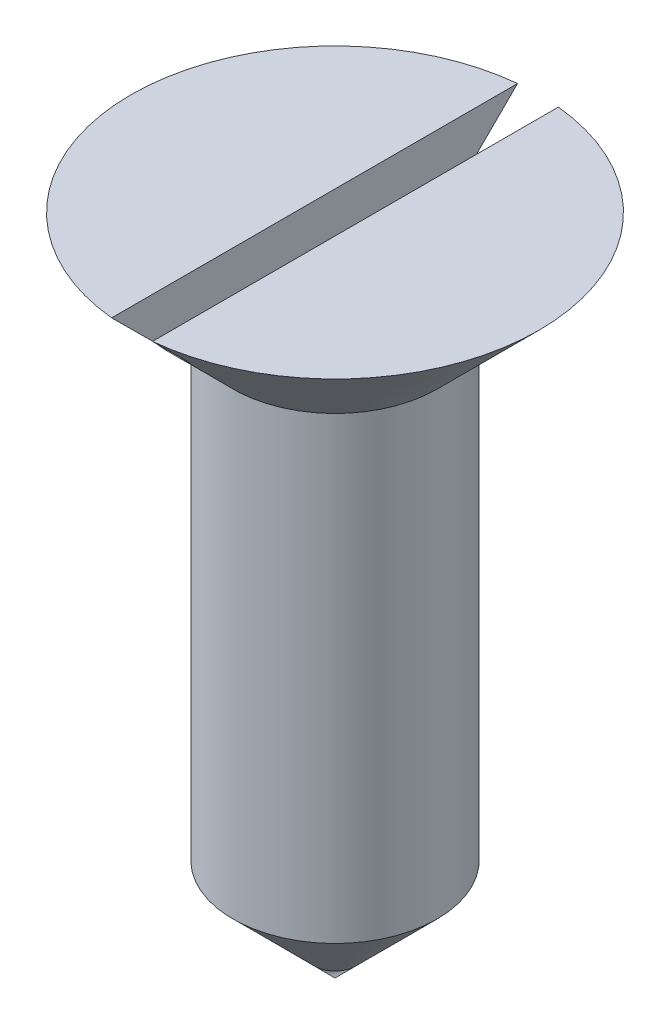
ISO-10303-21;
HEADER;
FILE_DESCRIPTION(('STEP AP214'),'2;1');
FILE_NAME('part.step','',(''),(''),'','','');
FILE_SCHEMA(('AUTOMOTIVE_DESIGN { 1 0 10303 214 1 1 1 1 }'));
ENDSEC;
DATA;
#1=APPLICATION_CONTEXT('core data for automotive mechanical design processes');
#2=APPLICATION_PROTOCOL_DEFINITION('international standard','automotive_design',2000,#1);
#3=PRODUCT_CONTEXT('',#1,'mechanical');
#4=PRODUCT('Part','Part','',(#3));
#5=PRODUCT_RELATED_PRODUCT_CATEGORY('part','',(#4));
#6=PRODUCT_DEFINITION_FORMATION('','',#4);
#7=PRODUCT_DEFINITION_CONTEXT('part definition',#1,'design');
#8=PRODUCT_DEFINITION('design','',#6,#7);
#9=PRODUCT_DEFINITION_SHAPE('','',#8);
#10=(LENGTH_UNIT() NAMED_UNIT(*) SI_UNIT(.MILLI.,.METRE.));
#11=(NAMED_UNIT(*) PLANE_ANGLE_UNIT() SI_UNIT($,.RADIAN.));
#12=(NAMED_UNIT(*) SI_UNIT($,.STERADIAN.) SOLID_ANGLE_UNIT());
#13=UNCERTAINTY_MEASURE_WITH_UNIT(LENGTH_MEASURE(1.E-05),#10,'distance_accuracy_value','');
#14=(GEOMETRIC_REPRESENTATION_CONTEXT(3) GLOBAL_UNCERTAINTY_ASSIGNED_CONTEXT((#13)) GLOBAL_UNIT_ASSIGNED_CONTEXT((#10,
#11,#12)) REPRESENTATION_CONTEXT('',''));
#15=CARTESIAN_POINT('',(0.,0.,0.));
#16=DIRECTION('',(0.,0.,1.));
#17=DIRECTION('',(1.,0.,0.));
#18=AXIS2_PLACEMENT_3D('',#15,#16,#17);
#19=CARTESIAN_POINT('',(12.0000000000001,38.9999999999999,0.));
#20=DIRECTION('',(0.,-1.,0.));
#21=DIRECTION('',(1.,0.,0.));
#22=AXIS2_PLACEMENT_3D('',#19,#20,#21);
#23=PLANE('',#22);
#24=DIRECTION('',(0.,0.,1.));
#25=VECTOR('',#24,1.);
#26=CARTESIAN_POINT('',(-1.2,38.9999999999999,-12.0000000000001));
#27=LINE('',#26,#25);
#28=CARTESIAN_POINT('',(-1.2,38.9999999999999,-11.9398492452795));
#29=VERTEX_POINT('',#28);
#30=CARTESIAN_POINT('',(-1.2,38.9999999999999,11.9398492452795));
#31=VERTEX_POINT('',#30);
#32=EDGE_CURVE('E122',#29,#31,#27,.T.);
#33=ORIENTED_EDGE('',*,*,#32,.F.);
#34=CARTESIAN_POINT('',(0.,38.9999999999999,0.));
#35=DIRECTION('',(0.,1.,0.));
#36=DIRECTION('',(-1.,0.,0.));
#37=AXIS2_PLACEMENT_3D('',#34,#35,#36);
#38=CIRCLE('',#37,12.0000000000001);
#39=EDGE_CURVE('E115',#29,#31,#38,.T.);
#40=ORIENTED_EDGE('',*,*,#39,.T.);
#41=EDGE_LOOP('',(#33,#40));
#42=FACE_BOUND('',#41,.T.);
#43=ADVANCED_FACE('F39',(#42),#23,.F.);
#44=CARTESIAN_POINT('',(1.2,38.9999999999999,11.9398492452795));
#45=VERTEX_POINT('',#44);
#46=CARTESIAN_POINT('',(1.2,38.9999999999999,-11.9398492452795));
#47=VERTEX_POINT('',#46);
#48=EDGE_CURVE('E103',#45,#47,#38,.T.);
#49=ORIENTED_EDGE('',*,*,#48,.T.);
#50=DIRECTION('',(0.,0.,1.));
#51=VECTOR('',#50,1.);
#52=CARTESIAN_POINT('',(1.2,38.9999999999999,-12.0000000000001));
#53=LINE('',#52,#51);
#54=EDGE_CURVE('E98',#47,#45,#53,.T.);
#55=ORIENTED_EDGE('',*,*,#54,.T.);
#56=EDGE_LOOP('',(#49,#55));
#57=FACE_BOUND('',#56,.T.);
#58=ADVANCED_FACE('F41',(#57),#23,.F.);
#59=CARTESIAN_POINT('',(0.,32.9999999999999,0.));
#60=DIRECTION('',(0.,1.,0.));
#61=DIRECTION('',(-1.,0.,0.));
#62=AXIS2_PLACEMENT_3D('',#59,#60,#61);
#63=CONICAL_SURFACE('',#62,6.00000000000001,0.785398163397453);
#64=CARTESIAN_POINT('',(0.,36.5999999999999,0.));
#65=DIRECTION('',(0.,-1.,0.));
#66=DIRECTION('',(0.,0.,-1.));
#67=AXIS2_PLACEMENT_3D('',#64,#65,#66);
#68=CIRCLE('',#67,9.60000000000004);
#69=CARTESIAN_POINT('',(1.2,36.5999999999999,9.52470471983256));
#70=VERTEX_POINT('',#69);
#71=CARTESIAN_POINT('',(-1.2,36.5999999999999,9.52470471983256));
#72=VERTEX_POINT('',#71);
#73=EDGE_CURVE('E82',#70,#72,#68,.T.);
#74=ORIENTED_EDGE('',*,*,#73,.T.);
#75=CARTESIAN_POINT('',(-1.2,39.0006999999999,-11.9405527715429));
#76=CARTESIAN_POINT('',(-1.2,38.6423416002496,-11.5803807526523));
#77=CARTESIAN_POINT('',(-1.2,38.2840565035962,-11.2201357392935));
#78=CARTESIAN_POINT('',(-1.2,37.5676642263219,-10.499387710375));
#79=CARTESIAN_POINT('',(-1.2,37.2095570704624,-10.1388846702052));
#80=CARTESIAN_POINT('',(-1.2,36.4926055924731,-9.41655481934521));
#81=CARTESIAN_POINT('',(-1.2,36.1337621054363,-9.05472717946474));
#82=CARTESIAN_POINT('',(-1.2,35.4165353835753,-8.33069608177914));
#83=CARTESIAN_POINT('',(-1.2,35.058152101868,-7.96849267040767));
#84=CARTESIAN_POINT('',(-1.2,34.2335716005982,-7.13373172990728));
#85=CARTESIAN_POINT('',(-1.2,33.7675849474407,-6.66096586588269));
#86=CARTESIAN_POINT('',(-1.2,33.0699505966334,-5.95031757170316));
#87=CARTESIAN_POINT('',(-1.2,32.8375857579809,-5.71313937083377));
#88=CARTESIAN_POINT('',(-1.2,32.3735635386664,-5.23811026335268));
#89=CARTESIAN_POINT('',(-1.2,32.141906129296,-5.00025938481456));
#90=CARTESIAN_POINT('',(-1.2,31.6802103820104,-4.52412893124832));
#91=CARTESIAN_POINT('',(-1.2,31.4501694589617,-4.28585186399647));
#92=CARTESIAN_POINT('',(-1.2,30.9916999256115,-3.80767386649112));
#93=CARTESIAN_POINT('',(-1.2,30.7632715723161,-3.5677726888176));
#94=CARTESIAN_POINT('',(-1.2,30.422914199185,-3.20592834050281));
#95=CARTESIAN_POINT('',(-1.2,30.309881723957,-3.08502408297147));
#96=CARTESIAN_POINT('',(-1.2,30.084853776665,-2.84225540452675));
#97=CARTESIAN_POINT('',(-1.2,29.9728582883818,-2.72039099868601));
#98=CARTESIAN_POINT('',(-1.2,29.7503895051625,-2.47533467791656));
#99=CARTESIAN_POINT('',(-1.2,29.6399158341305,-2.3521431048945));
#100=CARTESIAN_POINT('',(-1.2,29.421229527327,-2.10377345299086));
#101=CARTESIAN_POINT('',(-1.2,29.3130166625348,-1.97859557760515));
#102=CARTESIAN_POINT('',(-1.2,29.1644032477007,-1.80149246617658));
#103=CARTESIAN_POINT('',(-1.2,29.1224359337418,-1.75088304332431));
#104=CARTESIAN_POINT('',(-1.2,29.0392423376142,-1.64905313899005));
#105=CARTESIAN_POINT('',(-1.2,28.9980160922381,-1.59783262737751));
#106=CARTESIAN_POINT('',(-1.2,28.9164191931948,-1.49454568175153));
#107=CARTESIAN_POINT('',(-1.2,28.8760504204284,-1.44247775775405));
#108=CARTESIAN_POINT('',(-1.2,28.7965294858461,-1.33742209104177));
#109=CARTESIAN_POINT('',(-1.2,28.7573772521442,-1.28443440296596));
#110=CARTESIAN_POINT('',(-1.2,28.6813441390573,-1.17824811786083));
#111=CARTESIAN_POINT('',(-1.2,28.6444354653971,-1.12506952184761));
#112=CARTESIAN_POINT('',(-1.2,28.5726902572468,-1.017335182278));
#113=CARTESIAN_POINT('',(-1.2,28.5378533392008,-0.962779696313641));
#114=CARTESIAN_POINT('',(-1.2,28.4711006078347,-0.852104283458362));
#115=CARTESIAN_POINT('',(-1.2,28.4391768541612,-0.795989188313998));
#116=CARTESIAN_POINT('',(-1.2,28.3792630334841,-0.681712880411869));
#117=CARTESIAN_POINT('',(-1.2,28.3512695138165,-0.623553520401926));
#118=CARTESIAN_POINT('',(-1.2,28.3102167029489,-0.52706217106189));
#119=CARTESIAN_POINT('',(-1.2,28.2954861705816,-0.489444079208119));
#120=CARTESIAN_POINT('',(-1.2,28.2686661781939,-0.413261448679984));
#121=CARTESIAN_POINT('',(-1.2,28.2565769329876,-0.374696833308973));
#122=CARTESIAN_POINT('',(-1.2,28.2356262713429,-0.296925737463489));
#123=CARTESIAN_POINT('',(-1.2,28.226746712062,-0.257724216617876));
#124=CARTESIAN_POINT('',(-1.2,28.2126067566678,-0.178676226657235));
#125=CARTESIAN_POINT('',(-1.2,28.2073451056797,-0.138829986077026));
#126=CARTESIAN_POINT('',(-1.2,28.2007403272232,-0.0583390696045064));
#127=CARTESIAN_POINT('',(-1.2,28.1994435979692,-0.0176905010456873));
#128=CARTESIAN_POINT('',(-1.2,28.2009940227673,0.0635246699156782));
#129=CARTESIAN_POINT('',(-1.2,28.2038410896966,0.104091274023561));
#130=CARTESIAN_POINT('',(-1.2,28.2134951482038,0.184897515970321));
#131=CARTESIAN_POINT('',(-1.2,28.2203170886185,0.225135334864724));
#132=CARTESIAN_POINT('',(-1.2,28.2375046882177,0.304853239897229));
#133=CARTESIAN_POINT('',(-1.2,28.2478722160288,0.344332914860403));
#134=CARTESIAN_POINT('',(-1.2,28.2770236581048,0.440132983268946));
#135=CARTESIAN_POINT('',(-1.2,28.2974904674871,0.495938445583171));
#136=CARTESIAN_POINT('',(-1.2,28.3432035134076,0.60554451587173));
#137=CARTESIAN_POINT('',(-1.2,28.3684531557664,0.659343662287872));
#138=CARTESIAN_POINT('',(-1.2,28.4225702808062,0.765370995412279));
#139=CARTESIAN_POINT('',(-1.2,28.4514534660055,0.817591063624996));
#140=CARTESIAN_POINT('',(-1.2,28.5117994010604,0.920473249239708));
#141=CARTESIAN_POINT('',(-1.2,28.5432611204956,0.971135977955549));
#142=CARTESIAN_POINT('',(-1.2,28.6140889170137,1.08042665907477));
#143=CARTESIAN_POINT('',(-1.2,28.6538430614509,1.13880158854303));
#144=CARTESIAN_POINT('',(-1.2,28.7353076301648,1.25417614027948));
#145=CARTESIAN_POINT('',(-1.2,28.777018448639,1.31117548188424));
#146=CARTESIAN_POINT('',(-1.2,28.8619179198474,1.42412301996532));
#147=CARTESIAN_POINT('',(-1.2,28.9051076243244,1.48007042261138));
#148=CARTESIAN_POINT('',(-1.2,28.992592250477,1.59109618207402));
#149=CARTESIAN_POINT('',(-1.2,29.0368872351778,1.64617448903942));
#150=CARTESIAN_POINT('',(-1.2,29.1712611502524,1.81063741679226));
#151=CARTESIAN_POINT('',(-1.2,29.2626187934393,1.91897579220441));
#152=CARTESIAN_POINT('',(-1.2,29.4474338517645,2.13375118449821));
#153=CARTESIAN_POINT('',(-1.2,29.5408903711776,2.24018897893077));
#154=CARTESIAN_POINT('',(-1.2,29.7296598426751,2.45221973974451));
#155=CARTESIAN_POINT('',(-1.2,29.8249790208464,2.55780715289598));
#156=CARTESIAN_POINT('',(-1.2,30.0166597775515,2.76804900837813));
#157=CARTESIAN_POINT('',(-1.2,30.1130214627199,2.87270335323255));
#158=CARTESIAN_POINT('',(-1.2,30.3063467064892,3.08114310936147));
#159=CARTESIAN_POINT('',(-1.2,30.4033090580638,3.18492964145424));
#160=CARTESIAN_POINT('',(-1.2,30.5977997493211,3.39196358661666));
#161=CARTESIAN_POINT('',(-1.2,30.6953280690351,3.49521101846567));
#162=CARTESIAN_POINT('',(-1.2,30.9632371101944,3.77763041426034));
#163=CARTESIAN_POINT('',(-1.2,31.1340606437853,3.95638214675946));
#164=CARTESIAN_POINT('',(-1.2,31.4765905408304,4.3130382575412));
#165=CARTESIAN_POINT('',(-1.2,31.6482969096793,4.49094263063295));
#166=CARTESIAN_POINT('',(-1.2,32.1643409293289,5.02377908860372));
#167=CARTESIAN_POINT('',(-1.2,32.5095937753538,5.37782433911013));
#168=CARTESIAN_POINT('',(-1.2,33.2016787898392,6.08489370223228));
#169=CARTESIAN_POINT('',(-1.2,33.5485119621607,6.43791682985259));
#170=CARTESIAN_POINT('',(-1.2,34.2429892364007,7.14315475196612));
#171=CARTESIAN_POINT('',(-1.2,34.5906333269734,7.49536955763369));
#172=CARTESIAN_POINT('',(-1.2,35.2765252183433,8.18923192944849));
#173=CARTESIAN_POINT('',(-1.2,35.6147580931356,8.53089425931991));
#174=CARTESIAN_POINT('',(-1.2,36.2915754955556,9.21387349316356));
#175=CARTESIAN_POINT('',(-1.2,36.6301600247856,9.55519039554766));
#176=CARTESIAN_POINT('',(-1.2,37.3072978309614,10.2372886240569));
#177=CARTESIAN_POINT('',(-1.2,37.6458508972338,10.5780701593679));
#178=CARTESIAN_POINT('',(-1.2,38.3231472552781,11.2594406838061));
#179=CARTESIAN_POINT('',(-1.2,38.6618905460668,11.6000296739106));
#180=CARTESIAN_POINT('',(-1.2,39.0006999999999,11.9405527715429));
#181=B_SPLINE_CURVE_WITH_KNOTS('',3,(#75,#76,#77,#78,#79,#80,#81,#82,#83,#84,#85,#86,#87,#88,
#89,#90,#91,#92,#93,#94,#95,#96,#97,#98,#99,#100,#101,#102,#103,#104,#105,#106,#107,#108,#109,
#110,#111,#112,#113,#114,#115,#116,#117,#118,#119,#120,#121,#122,#123,#124,#125,#126,#127,#128,
#129,#130,#131,#132,#133,#134,#135,#136,#137,#138,#139,#140,#141,#142,#143,#144,#145,#146,#147,
#148,#149,#150,#151,#152,#153,#154,#155,#156,#157,#158,#159,#160,#161,#162,#163,#164,#165,#166,
#167,#168,#169,#170,#171,#172,#173,#174,#175,#176,#177,#178,#179,#180),.UNSPECIFIED.,.F.,.F.,(4,
2,2,2,2,2,2,2,2,2,2,2,2,2,2,2,2,2,2,2,2,2,2,2,2,2,2,2,2,2,2,2,2,2,2,2,2,2,2,2,2,2,2,2,2,2,2,2,2,
2,2,2,4),(0.,1.52423809521556,3.04864891141302,4.57743602038949,6.10605256370761,
8.0974955350484,9.09359823658857,10.0896599627187,11.0832627883764,12.0770205494555,
12.5735523251579,13.0700763216543,13.5664753244144,14.0628237955055,14.2600572190982,
14.4573004080694,14.6549390133926,14.8525659178153,15.0467264533976,15.2408509303253,
15.4344294099584,15.627836754632,15.7489568709175,15.8700868341609,15.9905209852859,
16.1109133426153,16.2327092626934,16.3545026220634,16.4767570097989,16.5990759286583,
16.7770767219962,16.9552047481768,17.1341308595527,17.3129858148212,17.5248067208322,
17.7366704857493,17.9486881863078,18.1607180042747,18.5858138163654,19.0107315363948,
19.4374649012327,19.8642423358546,20.2903381728068,20.7164190664928,21.4581656811292,
22.1999168338362,23.6834613442738,25.1681375645352,26.6527931353114,28.0950867256706,
29.5373869172841,30.9784809012042,32.4195675037597),.UNSPECIFIED.);
#182=EDGE_CURVE('E11',#72,#31,#181,.T.);
#183=ORIENTED_EDGE('',*,*,#182,.T.);
#184=ORIENTED_EDGE('',*,*,#39,.F.);
#185=CARTESIAN_POINT('',(-1.2,36.5999999999999,-9.52470471983256));
#186=VERTEX_POINT('',#185);
#187=EDGE_CURVE('E43',#29,#186,#181,.T.);
#188=ORIENTED_EDGE('',*,*,#187,.T.);
#189=CARTESIAN_POINT('',(1.2,36.5999999999999,-9.52470471983256));
#190=VERTEX_POINT('',#189);
#191=EDGE_CURVE('E95',#186,#190,#68,.T.);
#192=ORIENTED_EDGE('',*,*,#191,.T.);
#193=CARTESIAN_POINT('',(1.2,39.0006999999999,11.9405527715429));
#194=CARTESIAN_POINT('',(1.2,38.6423416002496,11.5803807526523));
#195=CARTESIAN_POINT('',(1.2,38.2840565035962,11.2201357392935));
#196=CARTESIAN_POINT('',(1.2,37.5676642263219,10.499387710375));
#197=CARTESIAN_POINT('',(1.2,37.2095570704624,10.1388846702052));
#198=CARTESIAN_POINT('',(1.2,36.4926055924731,9.41655481934521));
#199=CARTESIAN_POINT('',(1.2,36.1337621054363,9.05472717946474));
#200=CARTESIAN_POINT('',(1.2,35.4165353835753,8.33069608177914));
#201=CARTESIAN_POINT('',(1.2,35.058152101868,7.96849267040767));
#202=CARTESIAN_POINT('',(1.2,34.2335716005982,7.13373172990728));
#203=CARTESIAN_POINT('',(1.2,33.7675849474407,6.66096586588269));
#204=CARTESIAN_POINT('',(1.2,33.0699505966334,5.95031757170316));
#205=CARTESIAN_POINT('',(1.2,32.8375857579809,5.71313937083377));
#206=CARTESIAN_POINT('',(1.2,32.3735635386664,5.23811026335268));
#207=CARTESIAN_POINT('',(1.2,32.141906129296,5.00025938481456));
#208=CARTESIAN_POINT('',(1.2,31.6802103820104,4.52412893124832));
#209=CARTESIAN_POINT('',(1.2,31.4501694589617,4.28585186399647));
#210=CARTESIAN_POINT('',(1.2,30.9916999256115,3.80767386649112));
#211=CARTESIAN_POINT('',(1.2,30.7632715723161,3.5677726888176));
#212=CARTESIAN_POINT('',(1.2,30.422914199185,3.20592834050281));
#213=CARTESIAN_POINT('',(1.2,30.309881723957,3.08502408297147));
#214=CARTESIAN_POINT('',(1.2,30.084853776665,2.84225540452675));
#215=CARTESIAN_POINT('',(1.2,29.9728582883818,2.72039099868601));
#216=CARTESIAN_POINT('',(1.2,29.7503895051625,2.47533467791656));
#217=CARTESIAN_POINT('',(1.2,29.6399158341305,2.3521431048945));
#218=CARTESIAN_POINT('',(1.2,29.421229527327,2.10377345299086));
#219=CARTESIAN_POINT('',(1.2,29.3130166625348,1.97859557760515));
#220=CARTESIAN_POINT('',(1.2,29.1644032477007,1.80149246617658));
#221=CARTESIAN_POINT('',(1.2,29.1224359337418,1.75088304332431));
#222=CARTESIAN_POINT('',(1.2,29.0392423376142,1.64905313899005));
#223=CARTESIAN_POINT('',(1.2,28.9980160922381,1.59783262737751));
#224=CARTESIAN_POINT('',(1.2,28.9164191931948,1.49454568175153));
#225=CARTESIAN_POINT('',(1.2,28.8760504204284,1.44247775775405));
#226=CARTESIAN_POINT('',(1.2,28.7965294858461,1.33742209104177));
#227=CARTESIAN_POINT('',(1.2,28.7573772521442,1.28443440296596));
#228=CARTESIAN_POINT('',(1.2,28.6813441390573,1.17824811786083));
#229=CARTESIAN_POINT('',(1.2,28.6444354653971,1.12506952184761));
#230=CARTESIAN_POINT('',(1.2,28.5726902572468,1.017335182278));
#231=CARTESIAN_POINT('',(1.2,28.5378533392008,0.962779696313641));
#232=CARTESIAN_POINT('',(1.2,28.4711006078347,0.852104283458362));
#233=CARTESIAN_POINT('',(1.2,28.4391768541612,0.795989188313998));
#234=CARTESIAN_POINT('',(1.2,28.3792630334841,0.681712880411869));
#235=CARTESIAN_POINT('',(1.2,28.3512695138165,0.623553520401926));
#236=CARTESIAN_POINT('',(1.2,28.3102167029489,0.52706217106189));
#237=CARTESIAN_POINT('',(1.2,28.2954861705816,0.489444079208119));
#238=CARTESIAN_POINT('',(1.2,28.2686661781939,0.413261448679984));
#239=CARTESIAN_POINT('',(1.2,28.2565769329876,0.374696833308973));
#240=CARTESIAN_POINT('',(1.2,28.2356262713429,0.296925737463489));
#241=CARTESIAN_POINT('',(1.2,28.226746712062,0.257724216617876));
#242=CARTESIAN_POINT('',(1.2,28.2126067566678,0.178676226657235));
#243=CARTESIAN_POINT('',(1.2,28.2073451056797,0.138829986077026));
#244=CARTESIAN_POINT('',(1.2,28.2007403272232,0.0583390696045064));
#245=CARTESIAN_POINT('',(1.2,28.1994435979692,0.0176905010456873));
#246=CARTESIAN_POINT('',(1.2,28.2009940227673,-0.0635246699156782));
#247=CARTESIAN_POINT('',(1.2,28.2038410896966,-0.104091274023561));
#248=CARTESIAN_POINT('',(1.2,28.2134951482038,-0.184897515970321));
#249=CARTESIAN_POINT('',(1.2,28.2203170886185,-0.225135334864724));
#250=CARTESIAN_POINT('',(1.2,28.2375046882177,-0.304853239897229));
#251=CARTESIAN_POINT('',(1.2,28.2478722160288,-0.344332914860403));
#252=CARTESIAN_POINT('',(1.2,28.2770236581048,-0.440132983268946));
#253=CARTESIAN_POINT('',(1.2,28.2974904674871,-0.495938445583171));
#254=CARTESIAN_POINT('',(1.2,28.3432035134076,-0.60554451587173));
#255=CARTESIAN_POINT('',(1.2,28.3684531557664,-0.659343662287872));
#256=CARTESIAN_POINT('',(1.2,28.4225702808062,-0.765370995412279));
#257=CARTESIAN_POINT('',(1.2,28.4514534660055,-0.817591063624996));
#258=CARTESIAN_POINT('',(1.2,28.5117994010604,-0.920473249239708));
#259=CARTESIAN_POINT('',(1.2,28.5432611204956,-0.971135977955549));
#260=CARTESIAN_POINT('',(1.2,28.6140889170137,-1.08042665907477));
#261=CARTESIAN_POINT('',(1.2,28.6538430614509,-1.13880158854303));
#262=CARTESIAN_POINT('',(1.2,28.7353076301648,-1.25417614027948));
#263=CARTESIAN_POINT('',(1.2,28.777018448639,-1.31117548188424));
#264=CARTESIAN_POINT('',(1.2,28.8619179198474,-1.42412301996532));
#265=CARTESIAN_POINT('',(1.2,28.9051076243244,-1.48007042261138));
#266=CARTESIAN_POINT('',(1.2,28.992592250477,-1.59109618207402));
#267=CARTESIAN_POINT('',(1.2,29.0368872351778,-1.64617448903942));
#268=CARTESIAN_POINT('',(1.2,29.1712611502524,-1.81063741679226));
#269=CARTESIAN_POINT('',(1.2,29.2626187934393,-1.91897579220441));
#270=CARTESIAN_POINT('',(1.2,29.4474338517645,-2.13375118449821));
#271=CARTESIAN_POINT('',(1.2,29.5408903711776,-2.24018897893077));
#272=CARTESIAN_POINT('',(1.2,29.7296598426751,-2.45221973974451));
#273=CARTESIAN_POINT('',(1.2,29.8249790208464,-2.55780715289598));
#274=CARTESIAN_POINT('',(1.2,30.0166597775515,-2.76804900837813));
#275=CARTESIAN_POINT('',(1.2,30.1130214627199,-2.87270335323255));
#276=CARTESIAN_POINT('',(1.2,30.3063467064892,-3.08114310936147));
#277=CARTESIAN_POINT('',(1.2,30.4033090580638,-3.18492964145424));
#278=CARTESIAN_POINT('',(1.2,30.5977997493211,-3.39196358661666));
#279=CARTESIAN_POINT('',(1.2,30.6953280690351,-3.49521101846567));
#280=CARTESIAN_POINT('',(1.2,30.9632371101944,-3.77763041426034));
#281=CARTESIAN_POINT('',(1.2,31.1340606437853,-3.95638214675946));
#282=CARTESIAN_POINT('',(1.2,31.4765905408304,-4.3130382575412));
#283=CARTESIAN_POINT('',(1.2,31.6482969096793,-4.49094263063295));
#284=CARTESIAN_POINT('',(1.2,32.1643409293289,-5.02377908860372));
#285=CARTESIAN_POINT('',(1.2,32.5095937753538,-5.37782433911013));
#286=CARTESIAN_POINT('',(1.2,33.2016787898392,-6.08489370223228));
#287=CARTESIAN_POINT('',(1.2,33.5485119621607,-6.43791682985259));
#288=CARTESIAN_POINT('',(1.2,34.2429892364007,-7.14315475196612));
#289=CARTESIAN_POINT('',(1.2,34.5906333269734,-7.49536955763369));
#290=CARTESIAN_POINT('',(1.2,35.2765252183433,-8.18923192944849));
#291=CARTESIAN_POINT('',(1.2,35.6147580931356,-8.53089425931991));
#292=CARTESIAN_POINT('',(1.2,36.2915754955556,-9.21387349316356));
#293=CARTESIAN_POINT('',(1.2,36.6301600247856,-9.55519039554766));
#294=CARTESIAN_POINT('',(1.2,37.3072978309614,-10.2372886240569));
#295=CARTESIAN_POINT('',(1.2,37.6458508972338,-10.5780701593679));
#296=CARTESIAN_POINT('',(1.2,38.3231472552781,-11.2594406838061));
#297=CARTESIAN_POINT('',(1.2,38.6618905460668,-11.6000296739106));
#298=CARTESIAN_POINT('',(1.2,39.0006999999999,-11.9405527715429));
#299=B_SPLINE_CURVE_WITH_KNOTS('',3,(#193,#194,#195,#196,#197,#198,#199,#200,#201,#202,#203,
#204,#205,#206,#207,#208,#209,#210,#211,#212,#213,#214,#215,#216,#217,#218,#219,#220,#221,#222,
#223,#224,#225,#226,#227,#228,#229,#230,#231,#232,#233,#234,#235,#236,#237,#238,#239,#240,#241,
#242,#243,#244,#245,#246,#247,#248,#249,#250,#251,#252,#253,#254,#255,#256,#257,#258,#259,#260,
#261,#262,#263,#264,#265,#266,#267,#268,#269,#270,#271,#272,#273,#274,#275,#276,#277,#278,#279,
#280,#281,#282,#283,#284,#285,#286,#287,#288,#289,#290,#291,#292,#293,#294,#295,#296,#297,#298),
.UNSPECIFIED.,.F.,.F.,(4,2,2,2,2,2,2,2,2,2,2,2,2,2,2,2,2,2,2,2,2,2,2,2,2,2,2,2,2,2,2,2,2,2,2,2,
2,2,2,2,2,2,2,2,2,2,2,2,2,2,2,2,4),(0.,1.52423809521556,3.04864891141302,4.57743602038949,
6.10605256370761,8.0974955350484,9.09359823658857,10.0896599627187,11.0832627883764,
12.0770205494555,12.5735523251579,13.0700763216543,13.5664753244144,14.0628237955055,
14.2600572190982,14.4573004080694,14.6549390133926,14.8525659178153,15.0467264533976,
15.2408509303253,15.4344294099584,15.627836754632,15.7489568709175,15.8700868341609,
15.9905209852859,16.1109133426153,16.2327092626934,16.3545026220634,16.4767570097989,
16.5990759286583,16.7770767219962,16.9552047481768,17.1341308595527,17.3129858148212,
17.5248067208322,17.7366704857493,17.9486881863078,18.1607180042747,18.5858138163654,
19.0107315363948,19.4374649012327,19.8642423358546,20.2903381728068,20.7164190664928,
21.4581656811292,22.1999168338362,23.6834613442738,25.1681375645352,26.6527931353114,
28.0950867256706,29.5373869172841,30.9784809012042,32.4195675037597),.UNSPECIFIED.);
#300=EDGE_CURVE('E100',#190,#47,#299,.T.);
#301=ORIENTED_EDGE('',*,*,#300,.T.);
#302=ORIENTED_EDGE('',*,*,#48,.F.);
#303=EDGE_CURVE('E52',#45,#70,#299,.T.);
#304=ORIENTED_EDGE('',*,*,#303,.T.);
#305=EDGE_LOOP('',(#74,#183,#184,#188,#192,#301,#302,#304));
#306=FACE_BOUND('',#305,.T.);
#307=CARTESIAN_POINT('',(0.,32.9999999999999,0.));
#308=DIRECTION('',(0.,1.,0.));
#309=DIRECTION('',(-1.,0.,0.));
#310=AXIS2_PLACEMENT_3D('',#307,#308,#309);
#311=CIRCLE('',#310,6.00000000000001);
#312=CARTESIAN_POINT('',(-6.00000000000001,32.9999999999999,0.));
#313=VERTEX_POINT('',#312);
#314=EDGE_CURVE('E118',#313,#313,#311,.T.);
#315=ORIENTED_EDGE('',*,*,#314,.T.);
#316=EDGE_LOOP('',(#315));
#317=FACE_BOUND('',#316,.T.);
#318=ADVANCED_FACE('F105',(#306,#317),#63,.T.);
#319=CARTESIAN_POINT('',(0.,38.9999999999999,0.));
#320=DIRECTION('',(0.,1.,0.));
#321=DIRECTION('',(-1.,0.,0.));
#322=AXIS2_PLACEMENT_3D('',#319,#320,#321);
#323=CYLINDRICAL_SURFACE('',#322,6.00000000000001);
#324=ORIENTED_EDGE('',*,*,#314,.F.);
#325=EDGE_LOOP('',(#324));
#326=FACE_BOUND('',#325,.T.);
#327=CARTESIAN_POINT('',(0.,5.99999999999994,0.));
#328=DIRECTION('',(0.,1.,0.));
#329=DIRECTION('',(-1.,0.,0.));
#330=AXIS2_PLACEMENT_3D('',#327,#328,#329);
#331=CIRCLE('',#330,6.);
#332=CARTESIAN_POINT('',(-6.,5.99999999999994,0.));
#333=VERTEX_POINT('',#332);
#334=EDGE_CURVE('E117',#333,#333,#331,.T.);
#335=ORIENTED_EDGE('',*,*,#334,.T.);
#336=EDGE_LOOP('',(#335));
#337=FACE_BOUND('',#336,.T.);
#338=ADVANCED_FACE('F137',(#326,#337),#323,.T.);
#339=CARTESIAN_POINT('',(0.,0.,0.));
#340=DIRECTION('',(0.,1.,0.));
#341=DIRECTION('',(-1.,0.,0.));
#342=AXIS2_PLACEMENT_3D('',#339,#340,#341);
#343=CONICAL_SURFACE('',#342,0.,0.785398163397453);
#344=ORIENTED_EDGE('',*,*,#334,.F.);
#345=EDGE_LOOP('',(#344));
#346=FACE_BOUND('',#345,.T.);
#347=CARTESIAN_POINT('',(0.,0.,0.));
#348=VERTEX_POINT('',#347);
#349=VERTEX_LOOP('',#348);
#350=FACE_BOUND('',#349,.T.);
#351=ADVANCED_FACE('F143',(#346,#350),#343,.T.);
#352=CARTESIAN_POINT('',(-1.2,38.9999999999999,-12.0000000000001));
#353=DIRECTION('',(-1.,0.,0.));
#354=DIRECTION('',(0.,-1.,0.));
#355=AXIS2_PLACEMENT_3D('',#352,#353,#354);
#356=PLANE('',#355);
#357=ORIENTED_EDGE('',*,*,#32,.T.);
#358=ORIENTED_EDGE('',*,*,#182,.F.);
#359=DIRECTION('',(0.,0.,1.));
#360=VECTOR('',#359,1.);
#361=CARTESIAN_POINT('',(-1.2,36.5999999999999,-12.0000000000001));
#362=LINE('',#361,#360);
#363=EDGE_CURVE('E88',#186,#72,#362,.T.);
#364=ORIENTED_EDGE('',*,*,#363,.F.);
#365=ORIENTED_EDGE('',*,*,#187,.F.);
#366=EDGE_LOOP('',(#357,#358,#364,#365));
#367=FACE_BOUND('',#366,.T.);
#368=ADVANCED_FACE('F130',(#367),#356,.F.);
#369=CARTESIAN_POINT('',(1.2,38.9999999999999,-12.0000000000001));
#370=DIRECTION('',(1.,0.,0.));
#371=DIRECTION('',(0.,1.,0.));
#372=AXIS2_PLACEMENT_3D('',#369,#370,#371);
#373=PLANE('',#372);
#374=ORIENTED_EDGE('',*,*,#54,.F.);
#375=ORIENTED_EDGE('',*,*,#300,.F.);
#376=DIRECTION('',(0.,0.,1.));
#377=VECTOR('',#376,1.);
#378=CARTESIAN_POINT('',(1.2,36.5999999999999,-12.0000000000001));
#379=LINE('',#378,#377);
#380=EDGE_CURVE('E58',#190,#70,#379,.T.);
#381=ORIENTED_EDGE('',*,*,#380,.T.);
#382=ORIENTED_EDGE('',*,*,#303,.F.);
#383=EDGE_LOOP('',(#374,#375,#381,#382));
#384=FACE_BOUND('',#383,.T.);
#385=ADVANCED_FACE('F92',(#384),#373,.F.);
#386=CARTESIAN_POINT('',(-1.2,36.5999999999999,-12.0000000000001));
#387=DIRECTION('',(0.,-1.,0.));
#388=DIRECTION('',(0.,0.,-1.));
#389=AXIS2_PLACEMENT_3D('',#386,#387,#388);
#390=PLANE('',#389);
#391=ORIENTED_EDGE('',*,*,#380,.F.);
#392=ORIENTED_EDGE('',*,*,#191,.F.);
#393=ORIENTED_EDGE('',*,*,#363,.T.);
#394=ORIENTED_EDGE('',*,*,#73,.F.);
#395=EDGE_LOOP('',(#391,#392,#393,#394));
#396=FACE_BOUND('',#395,.T.);
#397=ADVANCED_FACE('F86',(#396),#390,.F.);
#398=CLOSED_SHELL('',(#43,#58,#318,#338,#351,#368,#385,#397));
#399=MANIFOLD_SOLID_BREP('B2',#398);
#400=ADVANCED_BREP_SHAPE_REPRESENTATION('',(#18,#399),#14);
#401=SHAPE_DEFINITION_REPRESENTATION(#9,#400);
ENDSEC;
END-ISO-10303-21;
